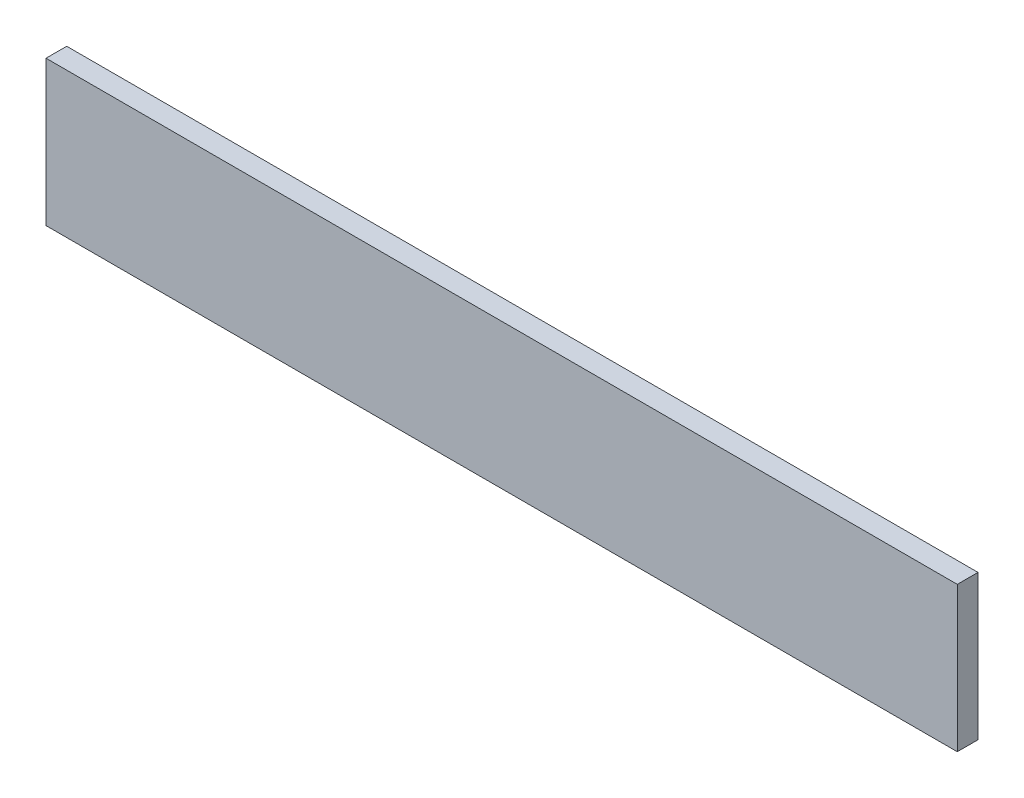
ISO-10303-21;
HEADER;
FILE_DESCRIPTION(('STEP AP214'),'2;1');
FILE_NAME('part.step','',(''),(''),'','','');
FILE_SCHEMA(('AUTOMOTIVE_DESIGN { 1 0 10303 214 1 1 1 1 }'));
ENDSEC;
DATA;
#1=APPLICATION_CONTEXT('core data for automotive mechanical design processes');
#2=APPLICATION_PROTOCOL_DEFINITION('international standard','automotive_design',2000,#1);
#3=PRODUCT_CONTEXT('',#1,'mechanical');
#4=PRODUCT('Part','Part','',(#3));
#5=PRODUCT_RELATED_PRODUCT_CATEGORY('part','',(#4));
#6=PRODUCT_DEFINITION_FORMATION('','',#4);
#7=PRODUCT_DEFINITION_CONTEXT('part definition',#1,'design');
#8=PRODUCT_DEFINITION('design','',#6,#7);
#9=PRODUCT_DEFINITION_SHAPE('','',#8);
#10=(LENGTH_UNIT() NAMED_UNIT(*) SI_UNIT(.MILLI.,.METRE.));
#11=(NAMED_UNIT(*) PLANE_ANGLE_UNIT() SI_UNIT($,.RADIAN.));
#12=(NAMED_UNIT(*) SI_UNIT($,.STERADIAN.) SOLID_ANGLE_UNIT());
#13=UNCERTAINTY_MEASURE_WITH_UNIT(LENGTH_MEASURE(1.E-05),#10,'distance_accuracy_value','');
#14=(GEOMETRIC_REPRESENTATION_CONTEXT(3) GLOBAL_UNCERTAINTY_ASSIGNED_CONTEXT((#13)) GLOBAL_UNIT_ASSIGNED_CONTEXT((#10,
#11,#12)) REPRESENTATION_CONTEXT('',''));
#15=CARTESIAN_POINT('',(0.,0.,0.));
#16=DIRECTION('',(0.,0.,1.));
#17=DIRECTION('',(1.,0.,0.));
#18=AXIS2_PLACEMENT_3D('',#15,#16,#17);
#19=CARTESIAN_POINT('',(0.,0.,2.5));
#20=DIRECTION('',(1.,0.,0.));
#21=DIRECTION('',(0.,0.,-1.));
#22=AXIS2_PLACEMENT_3D('',#19,#20,#21);
#23=PLANE('',#22);
#24=DIRECTION('',(0.,-1.,0.));
#25=VECTOR('',#24,1.);
#26=CARTESIAN_POINT('',(0.,0.,0.));
#27=LINE('',#26,#25);
#28=CARTESIAN_POINT('',(0.,17.5,0.));
#29=VERTEX_POINT('',#28);
#30=CARTESIAN_POINT('',(0.,0.,0.));
#31=VERTEX_POINT('',#30);
#32=EDGE_CURVE('E98',#29,#31,#27,.T.);
#33=ORIENTED_EDGE('',*,*,#32,.T.);
#34=DIRECTION('',(0.,0.,-1.));
#35=VECTOR('',#34,1.);
#36=CARTESIAN_POINT('',(0.,0.,2.5));
#37=LINE('',#36,#35);
#38=CARTESIAN_POINT('',(0.,0.,2.5));
#39=VERTEX_POINT('',#38);
#40=EDGE_CURVE('E11',#39,#31,#37,.T.);
#41=ORIENTED_EDGE('',*,*,#40,.F.);
#42=DIRECTION('',(0.,-1.,0.));
#43=VECTOR('',#42,1.);
#44=CARTESIAN_POINT('',(0.,0.,2.5));
#45=LINE('',#44,#43);
#46=CARTESIAN_POINT('',(0.,17.5,2.5));
#47=VERTEX_POINT('',#46);
#48=EDGE_CURVE('E86',#47,#39,#45,.T.);
#49=ORIENTED_EDGE('',*,*,#48,.F.);
#50=DIRECTION('',(0.,0.,-1.));
#51=VECTOR('',#50,1.);
#52=CARTESIAN_POINT('',(0.,17.5,2.5));
#53=LINE('',#52,#51);
#54=EDGE_CURVE('E94',#47,#29,#53,.T.);
#55=ORIENTED_EDGE('',*,*,#54,.T.);
#56=EDGE_LOOP('',(#33,#41,#49,#55));
#57=FACE_BOUND('',#56,.T.);
#58=ADVANCED_FACE('F35',(#57),#23,.F.);
#59=CARTESIAN_POINT('',(0.,0.,2.5));
#60=DIRECTION('',(0.,1.,0.));
#61=DIRECTION('',(0.,0.,1.));
#62=AXIS2_PLACEMENT_3D('',#59,#60,#61);
#63=PLANE('',#62);
#64=DIRECTION('',(1.,0.,0.));
#65=VECTOR('',#64,1.);
#66=CARTESIAN_POINT('',(0.,0.,0.));
#67=LINE('',#66,#65);
#68=CARTESIAN_POINT('',(110.,0.,0.));
#69=VERTEX_POINT('',#68);
#70=EDGE_CURVE('E90',#31,#69,#67,.T.);
#71=ORIENTED_EDGE('',*,*,#70,.T.);
#72=DIRECTION('',(0.,0.,-1.));
#73=VECTOR('',#72,1.);
#74=CARTESIAN_POINT('',(110.,0.,2.5));
#75=LINE('',#74,#73);
#76=CARTESIAN_POINT('',(110.,0.,2.5));
#77=VERTEX_POINT('',#76);
#78=EDGE_CURVE('E43',#77,#69,#75,.T.);
#79=ORIENTED_EDGE('',*,*,#78,.F.);
#80=DIRECTION('',(1.,0.,0.));
#81=VECTOR('',#80,1.);
#82=CARTESIAN_POINT('',(0.,0.,2.5));
#83=LINE('',#82,#81);
#84=EDGE_CURVE('E81',#39,#77,#83,.T.);
#85=ORIENTED_EDGE('',*,*,#84,.F.);
#86=ORIENTED_EDGE('',*,*,#40,.T.);
#87=EDGE_LOOP('',(#71,#79,#85,#86));
#88=FACE_BOUND('',#87,.T.);
#89=ADVANCED_FACE('F89',(#88),#63,.F.);
#90=CARTESIAN_POINT('',(110.,0.,2.5));
#91=DIRECTION('',(-1.,0.,0.));
#92=DIRECTION('',(0.,0.,1.));
#93=AXIS2_PLACEMENT_3D('',#90,#91,#92);
#94=PLANE('',#93);
#95=DIRECTION('',(0.,1.,0.));
#96=VECTOR('',#95,1.);
#97=CARTESIAN_POINT('',(110.,0.,0.));
#98=LINE('',#97,#96);
#99=CARTESIAN_POINT('',(110.,17.5,0.));
#100=VERTEX_POINT('',#99);
#101=EDGE_CURVE('E68',#69,#100,#98,.T.);
#102=ORIENTED_EDGE('',*,*,#101,.T.);
#103=DIRECTION('',(0.,0.,-1.));
#104=VECTOR('',#103,1.);
#105=CARTESIAN_POINT('',(110.,17.5,2.5));
#106=LINE('',#105,#104);
#107=CARTESIAN_POINT('',(110.,17.5,2.5));
#108=VERTEX_POINT('',#107);
#109=EDGE_CURVE('E91',#108,#100,#106,.T.);
#110=ORIENTED_EDGE('',*,*,#109,.F.);
#111=DIRECTION('',(0.,1.,0.));
#112=VECTOR('',#111,1.);
#113=CARTESIAN_POINT('',(110.,0.,2.5));
#114=LINE('',#113,#112);
#115=EDGE_CURVE('E84',#77,#108,#114,.T.);
#116=ORIENTED_EDGE('',*,*,#115,.F.);
#117=ORIENTED_EDGE('',*,*,#78,.T.);
#118=EDGE_LOOP('',(#102,#110,#116,#117));
#119=FACE_BOUND('',#118,.T.);
#120=ADVANCED_FACE('F92',(#119),#94,.F.);
#121=CARTESIAN_POINT('',(0.,17.5,2.5));
#122=DIRECTION('',(0.,-1.,0.));
#123=DIRECTION('',(0.,0.,-1.));
#124=AXIS2_PLACEMENT_3D('',#121,#122,#123);
#125=PLANE('',#124);
#126=DIRECTION('',(-1.,0.,0.));
#127=VECTOR('',#126,1.);
#128=CARTESIAN_POINT('',(0.,17.5,0.));
#129=LINE('',#128,#127);
#130=EDGE_CURVE('E74',#100,#29,#129,.T.);
#131=ORIENTED_EDGE('',*,*,#130,.T.);
#132=ORIENTED_EDGE('',*,*,#54,.F.);
#133=DIRECTION('',(-1.,0.,0.));
#134=VECTOR('',#133,1.);
#135=CARTESIAN_POINT('',(0.,17.5,2.5));
#136=LINE('',#135,#134);
#137=EDGE_CURVE('E51',#108,#47,#136,.T.);
#138=ORIENTED_EDGE('',*,*,#137,.F.);
#139=ORIENTED_EDGE('',*,*,#109,.T.);
#140=EDGE_LOOP('',(#131,#132,#138,#139));
#141=FACE_BOUND('',#140,.T.);
#142=ADVANCED_FACE('F105',(#141),#125,.F.);
#143=CARTESIAN_POINT('',(0.,0.,2.5));
#144=DIRECTION('',(0.,0.,-1.));
#145=DIRECTION('',(-1.,0.,0.));
#146=AXIS2_PLACEMENT_3D('',#143,#144,#145);
#147=PLANE('',#146);
#148=ORIENTED_EDGE('',*,*,#48,.T.);
#149=ORIENTED_EDGE('',*,*,#84,.T.);
#150=ORIENTED_EDGE('',*,*,#115,.T.);
#151=ORIENTED_EDGE('',*,*,#137,.T.);
#152=EDGE_LOOP('',(#148,#149,#150,#151));
#153=FACE_BOUND('',#152,.T.);
#154=ADVANCED_FACE('F82',(#153),#147,.F.);
#155=CARTESIAN_POINT('',(0.,0.,0.));
#156=DIRECTION('',(0.,0.,-1.));
#157=DIRECTION('',(-1.,0.,0.));
#158=AXIS2_PLACEMENT_3D('',#155,#156,#157);
#159=PLANE('',#158);
#160=ORIENTED_EDGE('',*,*,#32,.F.);
#161=ORIENTED_EDGE('',*,*,#130,.F.);
#162=ORIENTED_EDGE('',*,*,#101,.F.);
#163=ORIENTED_EDGE('',*,*,#70,.F.);
#164=EDGE_LOOP('',(#160,#161,#162,#163));
#165=FACE_BOUND('',#164,.T.);
#166=ADVANCED_FACE('F108',(#165),#159,.T.);
#167=CLOSED_SHELL('',(#58,#89,#120,#142,#154,#166));
#168=MANIFOLD_SOLID_BREP('B2',#167);
#169=ADVANCED_BREP_SHAPE_REPRESENTATION('',(#18,#168),#14);
#170=SHAPE_DEFINITION_REPRESENTATION(#9,#169);
ENDSEC;
END-ISO-10303-21;
